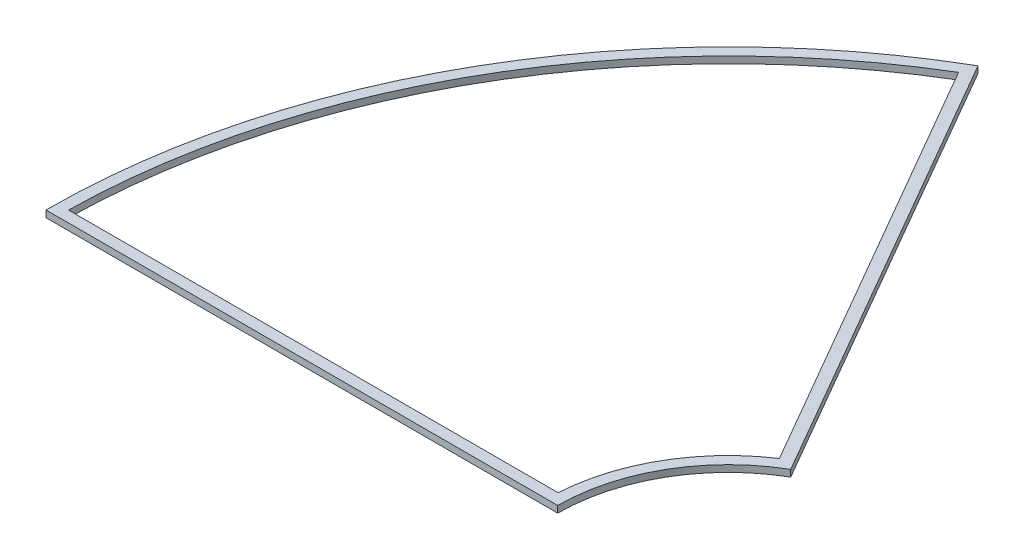
ISO-10303-21;
HEADER;
FILE_DESCRIPTION(('STEP AP214'),'2;1');
FILE_NAME('part.step','',(''),(''),'','','');
FILE_SCHEMA(('AUTOMOTIVE_DESIGN { 1 0 10303 214 1 1 1 1 }'));
ENDSEC;
DATA;
#1=APPLICATION_CONTEXT('core data for automotive mechanical design processes');
#2=APPLICATION_PROTOCOL_DEFINITION('international standard','automotive_design',2000,#1);
#3=PRODUCT_CONTEXT('',#1,'mechanical');
#4=PRODUCT('Part','Part','',(#3));
#5=PRODUCT_RELATED_PRODUCT_CATEGORY('part','',(#4));
#6=PRODUCT_DEFINITION_FORMATION('','',#4);
#7=PRODUCT_DEFINITION_CONTEXT('part definition',#1,'design');
#8=PRODUCT_DEFINITION('design','',#6,#7);
#9=PRODUCT_DEFINITION_SHAPE('','',#8);
#10=(LENGTH_UNIT() NAMED_UNIT(*) SI_UNIT(.MILLI.,.METRE.));
#11=(NAMED_UNIT(*) PLANE_ANGLE_UNIT() SI_UNIT($,.RADIAN.));
#12=(NAMED_UNIT(*) SI_UNIT($,.STERADIAN.) SOLID_ANGLE_UNIT());
#13=UNCERTAINTY_MEASURE_WITH_UNIT(LENGTH_MEASURE(1.E-05),#10,'distance_accuracy_value','');
#14=(GEOMETRIC_REPRESENTATION_CONTEXT(3) GLOBAL_UNCERTAINTY_ASSIGNED_CONTEXT((#13)) GLOBAL_UNIT_ASSIGNED_CONTEXT((#10,
#11,#12)) REPRESENTATION_CONTEXT('',''));
#15=CARTESIAN_POINT('',(0.,0.,0.));
#16=DIRECTION('',(0.,0.,1.));
#17=DIRECTION('',(1.,0.,0.));
#18=AXIS2_PLACEMENT_3D('',#15,#16,#17);
#19=CARTESIAN_POINT('',(1.11022302462516E-13,6.,0.));
#20=DIRECTION('',(0.,-1.,0.));
#21=DIRECTION('',(0.,0.,-1.));
#22=AXIS2_PLACEMENT_3D('',#19,#20,#21);
#23=CYLINDRICAL_SURFACE('',#22,599.6);
#24=CARTESIAN_POINT('',(1.11022302462516E-13,0.,0.));
#25=DIRECTION('',(0.,1.,0.));
#26=DIRECTION('',(0.,0.,1.));
#27=AXIS2_PLACEMENT_3D('',#24,#25,#26);
#28=CIRCLE('',#27,599.6);
#29=CARTESIAN_POINT('',(-599.516605274616,0.,-10.));
#30=VERTEX_POINT('',#29);
#31=CARTESIAN_POINT('',(-308.418556675151,0.,-514.196610158426));
#32=VERTEX_POINT('',#31);
#33=EDGE_CURVE('E166',#30,#32,#28,.F.);
#34=ORIENTED_EDGE('',*,*,#33,.T.);
#35=DIRECTION('',(0.,-1.,0.));
#36=VECTOR('',#35,1.);
#37=CARTESIAN_POINT('',(-308.418556675151,6.,-514.196610158426));
#38=LINE('',#37,#36);
#39=CARTESIAN_POINT('',(-308.418556675151,6.,-514.196610158426));
#40=VERTEX_POINT('',#39);
#41=EDGE_CURVE('E11',#40,#32,#38,.T.);
#42=ORIENTED_EDGE('',*,*,#41,.F.);
#43=CARTESIAN_POINT('',(1.11022302462516E-13,6.,0.));
#44=DIRECTION('',(0.,1.,0.));
#45=DIRECTION('',(0.,0.,1.));
#46=AXIS2_PLACEMENT_3D('',#43,#44,#45);
#47=CIRCLE('',#46,599.6);
#48=CARTESIAN_POINT('',(-599.516605274616,6.,-10.));
#49=VERTEX_POINT('',#48);
#50=EDGE_CURVE('E138',#49,#40,#47,.F.);
#51=ORIENTED_EDGE('',*,*,#50,.F.);
#52=DIRECTION('',(0.,-1.,0.));
#53=VECTOR('',#52,1.);
#54=CARTESIAN_POINT('',(-599.516605274616,6.,-10.));
#55=LINE('',#54,#53);
#56=EDGE_CURVE('E177',#49,#30,#55,.T.);
#57=ORIENTED_EDGE('',*,*,#56,.T.);
#58=EDGE_LOOP('',(#34,#42,#51,#57));
#59=FACE_BOUND('',#58,.T.);
#60=ADVANCED_FACE('F47',(#59),#23,.F.);
#61=CARTESIAN_POINT('',(-8.6602540378462,6.,5.00000000000098));
#62=DIRECTION('',(-0.866025403784442,0.,0.499999999999995));
#63=DIRECTION('',(0.499999999999995,0.,0.866025403784442));
#64=AXIS2_PLACEMENT_3D('',#61,#62,#63);
#65=PLANE('',#64);
#66=DIRECTION('',(-0.499999999999995,0.,-0.866025403784442));
#67=VECTOR('',#66,1.);
#68=CARTESIAN_POINT('',(-8.6602540378462,0.,5.00000000000098));
#69=LINE('',#68,#67);
#70=CARTESIAN_POINT('',(-89.7061669514525,0.,-135.37563891217));
#71=VERTEX_POINT('',#70);
#72=EDGE_CURVE('E128',#71,#32,#69,.T.);
#73=ORIENTED_EDGE('',*,*,#72,.F.);
#74=DIRECTION('',(0.,-1.,0.));
#75=VECTOR('',#74,1.);
#76=CARTESIAN_POINT('',(-89.7061669514525,6.,-135.37563891217));
#77=LINE('',#76,#75);
#78=CARTESIAN_POINT('',(-89.7061669514525,6.,-135.37563891217));
#79=VERTEX_POINT('',#78);
#80=EDGE_CURVE('E58',#79,#71,#77,.T.);
#81=ORIENTED_EDGE('',*,*,#80,.F.);
#82=DIRECTION('',(-0.499999999999995,0.,-0.866025403784442));
#83=VECTOR('',#82,1.);
#84=CARTESIAN_POINT('',(-8.6602540378462,6.,5.00000000000098));
#85=LINE('',#84,#83);
#86=EDGE_CURVE('E126',#79,#40,#85,.T.);
#87=ORIENTED_EDGE('',*,*,#86,.T.);
#88=ORIENTED_EDGE('',*,*,#41,.T.);
#89=EDGE_LOOP('',(#73,#81,#87,#88));
#90=FACE_BOUND('',#89,.T.);
#91=ADVANCED_FACE('F124',(#90),#65,.T.);
#92=CARTESIAN_POINT('',(0.,6.,0.));
#93=DIRECTION('',(0.,-1.,0.));
#94=DIRECTION('',(0.,0.,-1.));
#95=AXIS2_PLACEMENT_3D('',#92,#93,#94);
#96=CYLINDRICAL_SURFACE('',#95,162.4);
#97=CARTESIAN_POINT('',(0.,0.,0.));
#98=DIRECTION('',(0.,1.,0.));
#99=DIRECTION('',(0.,0.,1.));
#100=AXIS2_PLACEMENT_3D('',#97,#98,#99);
#101=CIRCLE('',#100,162.4);
#102=CARTESIAN_POINT('',(-162.091825827214,0.,-10.));
#103=VERTEX_POINT('',#102);
#104=EDGE_CURVE('E94',#71,#103,#101,.T.);
#105=ORIENTED_EDGE('',*,*,#104,.T.);
#106=DIRECTION('',(0.,-1.,0.));
#107=VECTOR('',#106,1.);
#108=CARTESIAN_POINT('',(-162.091825827214,6.,-10.));
#109=LINE('',#108,#107);
#110=CARTESIAN_POINT('',(-162.091825827214,6.,-10.));
#111=VERTEX_POINT('',#110);
#112=EDGE_CURVE('E130',#111,#103,#109,.T.);
#113=ORIENTED_EDGE('',*,*,#112,.F.);
#114=CARTESIAN_POINT('',(0.,6.,0.));
#115=DIRECTION('',(0.,1.,0.));
#116=DIRECTION('',(0.,0.,1.));
#117=AXIS2_PLACEMENT_3D('',#114,#115,#116);
#118=CIRCLE('',#117,162.4);
#119=EDGE_CURVE('E132',#79,#111,#118,.T.);
#120=ORIENTED_EDGE('',*,*,#119,.F.);
#121=ORIENTED_EDGE('',*,*,#80,.T.);
#122=EDGE_LOOP('',(#105,#113,#120,#121));
#123=FACE_BOUND('',#122,.T.);
#124=ADVANCED_FACE('F133',(#123),#96,.T.);
#125=CARTESIAN_POINT('',(0.,6.,0.));
#126=DIRECTION('',(0.,-1.,0.));
#127=DIRECTION('',(0.,0.,-1.));
#128=AXIS2_PLACEMENT_3D('',#125,#126,#127);
#129=CYLINDRICAL_SURFACE('',#128,152.4);
#130=CARTESIAN_POINT('',(0.,0.,0.));
#131=DIRECTION('',(0.,1.,0.));
#132=DIRECTION('',(0.,0.,1.));
#133=AXIS2_PLACEMENT_3D('',#130,#131,#132);
#134=CIRCLE('',#133,152.4);
#135=CARTESIAN_POINT('',(-76.200000000001,0.,-131.982271536748));
#136=VERTEX_POINT('',#135);
#137=CARTESIAN_POINT('',(-152.4,0.,0.));
#138=VERTEX_POINT('',#137);
#139=EDGE_CURVE('E150',#136,#138,#134,.T.);
#140=ORIENTED_EDGE('',*,*,#139,.F.);
#141=DIRECTION('',(0.,-1.,0.));
#142=VECTOR('',#141,1.);
#143=CARTESIAN_POINT('',(-76.200000000001,6.,-131.982271536748));
#144=LINE('',#143,#142);
#145=CARTESIAN_POINT('',(-76.200000000001,6.,-131.982271536748));
#146=VERTEX_POINT('',#145);
#147=EDGE_CURVE('E51',#146,#136,#144,.T.);
#148=ORIENTED_EDGE('',*,*,#147,.F.);
#149=CARTESIAN_POINT('',(0.,6.,0.));
#150=DIRECTION('',(0.,1.,0.));
#151=DIRECTION('',(0.,0.,1.));
#152=AXIS2_PLACEMENT_3D('',#149,#150,#151);
#153=CIRCLE('',#152,152.4);
#154=CARTESIAN_POINT('',(-152.4,6.,0.));
#155=VERTEX_POINT('',#154);
#156=EDGE_CURVE('E176',#146,#155,#153,.T.);
#157=ORIENTED_EDGE('',*,*,#156,.T.);
#158=DIRECTION('',(0.,-1.,0.));
#159=VECTOR('',#158,1.);
#160=CARTESIAN_POINT('',(-152.4,6.,0.));
#161=LINE('',#160,#159);
#162=EDGE_CURVE('E149',#155,#138,#161,.T.);
#163=ORIENTED_EDGE('',*,*,#162,.T.);
#164=EDGE_LOOP('',(#140,#148,#157,#163));
#165=FACE_BOUND('',#164,.T.);
#166=ADVANCED_FACE('F49',(#165),#129,.F.);
#167=CARTESIAN_POINT('',(-1.69461086737552E-12,6.,9.7838404045091E-13));
#168=DIRECTION('',(-0.866025403784441,0.,0.499999999999995));
#169=DIRECTION('',(0.499999999999995,0.,0.866025403784441));
#170=AXIS2_PLACEMENT_3D('',#167,#168,#169);
#171=PLANE('',#170);
#172=DIRECTION('',(-0.499999999999995,0.,-0.866025403784441));
#173=VECTOR('',#172,1.);
#174=CARTESIAN_POINT('',(-1.69461086737552E-12,0.,9.7838404045091E-13));
#175=LINE('',#174,#173);
#176=CARTESIAN_POINT('',(-304.799999999999,0.,-527.929086146995));
#177=VERTEX_POINT('',#176);
#178=EDGE_CURVE('E154',#136,#177,#175,.T.);
#179=ORIENTED_EDGE('',*,*,#178,.T.);
#180=DIRECTION('',(0.,-1.,0.));
#181=VECTOR('',#180,1.);
#182=CARTESIAN_POINT('',(-304.799999999999,6.,-527.929086146995));
#183=LINE('',#182,#181);
#184=CARTESIAN_POINT('',(-304.799999999999,6.,-527.929086146995));
#185=VERTEX_POINT('',#184);
#186=EDGE_CURVE('E186',#185,#177,#183,.T.);
#187=ORIENTED_EDGE('',*,*,#186,.F.);
#188=DIRECTION('',(-0.499999999999995,0.,-0.866025403784441));
#189=VECTOR('',#188,1.);
#190=CARTESIAN_POINT('',(-1.69461086737552E-12,6.,9.7838404045091E-13));
#191=LINE('',#190,#189);
#192=EDGE_CURVE('E196',#146,#185,#191,.T.);
#193=ORIENTED_EDGE('',*,*,#192,.F.);
#194=ORIENTED_EDGE('',*,*,#147,.T.);
#195=EDGE_LOOP('',(#179,#187,#193,#194));
#196=FACE_BOUND('',#195,.T.);
#197=ADVANCED_FACE('F195',(#196),#171,.F.);
#198=CARTESIAN_POINT('',(1.11022302462516E-13,6.,0.));
#199=DIRECTION('',(0.,-1.,0.));
#200=DIRECTION('',(0.,0.,-1.));
#201=AXIS2_PLACEMENT_3D('',#198,#199,#200);
#202=CYLINDRICAL_SURFACE('',#201,609.6);
#203=CARTESIAN_POINT('',(1.11022302462516E-13,0.,0.));
#204=DIRECTION('',(0.,1.,0.));
#205=DIRECTION('',(0.,0.,1.));
#206=AXIS2_PLACEMENT_3D('',#203,#204,#205);
#207=CIRCLE('',#206,609.6);
#208=CARTESIAN_POINT('',(-609.6,0.,0.));
#209=VERTEX_POINT('',#208);
#210=EDGE_CURVE('E158',#209,#177,#207,.F.);
#211=ORIENTED_EDGE('',*,*,#210,.F.);
#212=DIRECTION('',(0.,-1.,0.));
#213=VECTOR('',#212,1.);
#214=CARTESIAN_POINT('',(-609.6,6.,0.));
#215=LINE('',#214,#213);
#216=CARTESIAN_POINT('',(-609.6,6.,0.));
#217=VERTEX_POINT('',#216);
#218=EDGE_CURVE('E184',#217,#209,#215,.T.);
#219=ORIENTED_EDGE('',*,*,#218,.F.);
#220=CARTESIAN_POINT('',(1.11022302462516E-13,6.,0.));
#221=DIRECTION('',(0.,1.,0.));
#222=DIRECTION('',(0.,0.,1.));
#223=AXIS2_PLACEMENT_3D('',#220,#221,#222);
#224=CIRCLE('',#223,609.6);
#225=EDGE_CURVE('E237',#217,#185,#224,.F.);
#226=ORIENTED_EDGE('',*,*,#225,.T.);
#227=ORIENTED_EDGE('',*,*,#186,.T.);
#228=EDGE_LOOP('',(#211,#219,#226,#227));
#229=FACE_BOUND('',#228,.T.);
#230=ADVANCED_FACE('F207',(#229),#202,.T.);
#231=CARTESIAN_POINT('',(0.,6.,0.));
#232=DIRECTION('',(0.,0.,1.));
#233=DIRECTION('',(1.,0.,0.));
#234=AXIS2_PLACEMENT_3D('',#231,#232,#233);
#235=PLANE('',#234);
#236=DIRECTION('',(-1.,0.,0.));
#237=VECTOR('',#236,1.);
#238=CARTESIAN_POINT('',(0.,0.,0.));
#239=LINE('',#238,#237);
#240=EDGE_CURVE('E162',#138,#209,#239,.T.);
#241=ORIENTED_EDGE('',*,*,#240,.F.);
#242=ORIENTED_EDGE('',*,*,#162,.F.);
#243=DIRECTION('',(-1.,0.,0.));
#244=VECTOR('',#243,1.);
#245=CARTESIAN_POINT('',(0.,6.,0.));
#246=LINE('',#245,#244);
#247=EDGE_CURVE('E143',#155,#217,#246,.T.);
#248=ORIENTED_EDGE('',*,*,#247,.T.);
#249=ORIENTED_EDGE('',*,*,#218,.T.);
#250=EDGE_LOOP('',(#241,#242,#248,#249));
#251=FACE_BOUND('',#250,.T.);
#252=ADVANCED_FACE('F205',(#251),#235,.T.);
#253=CARTESIAN_POINT('',(0.,6.,-10.));
#254=DIRECTION('',(0.,0.,1.));
#255=DIRECTION('',(1.,0.,0.));
#256=AXIS2_PLACEMENT_3D('',#253,#254,#255);
#257=PLANE('',#256);
#258=DIRECTION('',(-1.,0.,0.));
#259=VECTOR('',#258,1.);
#260=CARTESIAN_POINT('',(0.,0.,-10.));
#261=LINE('',#260,#259);
#262=EDGE_CURVE('E100',#103,#30,#261,.T.);
#263=ORIENTED_EDGE('',*,*,#262,.T.);
#264=ORIENTED_EDGE('',*,*,#56,.F.);
#265=DIRECTION('',(-1.,0.,0.));
#266=VECTOR('',#265,1.);
#267=CARTESIAN_POINT('',(0.,6.,-10.));
#268=LINE('',#267,#266);
#269=EDGE_CURVE('E67',#111,#49,#268,.T.);
#270=ORIENTED_EDGE('',*,*,#269,.F.);
#271=ORIENTED_EDGE('',*,*,#112,.T.);
#272=EDGE_LOOP('',(#263,#264,#270,#271));
#273=FACE_BOUND('',#272,.T.);
#274=ADVANCED_FACE('F214',(#273),#257,.F.);
#275=CARTESIAN_POINT('',(0.,6.,0.));
#276=DIRECTION('',(0.,1.,0.));
#277=DIRECTION('',(0.,0.,1.));
#278=AXIS2_PLACEMENT_3D('',#275,#276,#277);
#279=PLANE('',#278);
#280=ORIENTED_EDGE('',*,*,#156,.F.);
#281=ORIENTED_EDGE('',*,*,#192,.T.);
#282=ORIENTED_EDGE('',*,*,#225,.F.);
#283=ORIENTED_EDGE('',*,*,#247,.F.);
#284=EDGE_LOOP('',(#280,#281,#282,#283));
#285=FACE_BOUND('',#284,.T.);
#286=ORIENTED_EDGE('',*,*,#50,.T.);
#287=ORIENTED_EDGE('',*,*,#86,.F.);
#288=ORIENTED_EDGE('',*,*,#119,.T.);
#289=ORIENTED_EDGE('',*,*,#269,.T.);
#290=EDGE_LOOP('',(#286,#287,#288,#289));
#291=FACE_BOUND('',#290,.T.);
#292=ADVANCED_FACE('F136',(#285,#291),#279,.T.);
#293=CARTESIAN_POINT('',(0.,0.,0.));
#294=DIRECTION('',(0.,1.,0.));
#295=DIRECTION('',(0.,0.,1.));
#296=AXIS2_PLACEMENT_3D('',#293,#294,#295);
#297=PLANE('',#296);
#298=ORIENTED_EDGE('',*,*,#139,.T.);
#299=ORIENTED_EDGE('',*,*,#240,.T.);
#300=ORIENTED_EDGE('',*,*,#210,.T.);
#301=ORIENTED_EDGE('',*,*,#178,.F.);
#302=EDGE_LOOP('',(#298,#299,#300,#301));
#303=FACE_BOUND('',#302,.T.);
#304=ORIENTED_EDGE('',*,*,#33,.F.);
#305=ORIENTED_EDGE('',*,*,#262,.F.);
#306=ORIENTED_EDGE('',*,*,#104,.F.);
#307=ORIENTED_EDGE('',*,*,#72,.T.);
#308=EDGE_LOOP('',(#304,#305,#306,#307));
#309=FACE_BOUND('',#308,.T.);
#310=ADVANCED_FACE('F199',(#303,#309),#297,.F.);
#311=CLOSED_SHELL('',(#60,#91,#124,#166,#197,#230,#252,#274,#292,#310));
#312=MANIFOLD_SOLID_BREP('B2',#311);
#313=ADVANCED_BREP_SHAPE_REPRESENTATION('',(#18,#312),#14);
#314=SHAPE_DEFINITION_REPRESENTATION(#9,#313);
ENDSEC;
END-ISO-10303-21;
